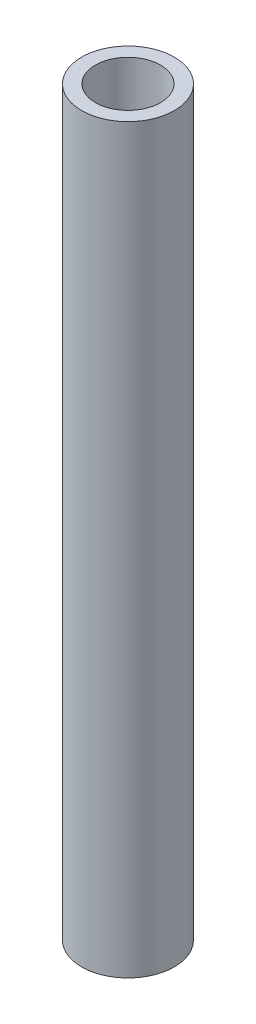
ISO-10303-21;
HEADER;
FILE_DESCRIPTION(('STEP AP214'),'2;1');
FILE_NAME('part.step','',(''),(''),'','','');
FILE_SCHEMA(('AUTOMOTIVE_DESIGN { 1 0 10303 214 1 1 1 1 }'));
ENDSEC;
DATA;
#1=APPLICATION_CONTEXT('core data for automotive mechanical design processes');
#2=APPLICATION_PROTOCOL_DEFINITION('international standard','automotive_design',2000,#1);
#3=PRODUCT_CONTEXT('',#1,'mechanical');
#4=PRODUCT('Part','Part','',(#3));
#5=PRODUCT_RELATED_PRODUCT_CATEGORY('part','',(#4));
#6=PRODUCT_DEFINITION_FORMATION('','',#4);
#7=PRODUCT_DEFINITION_CONTEXT('part definition',#1,'design');
#8=PRODUCT_DEFINITION('design','',#6,#7);
#9=PRODUCT_DEFINITION_SHAPE('','',#8);
#10=(LENGTH_UNIT() NAMED_UNIT(*) SI_UNIT(.MILLI.,.METRE.));
#11=(NAMED_UNIT(*) PLANE_ANGLE_UNIT() SI_UNIT($,.RADIAN.));
#12=(NAMED_UNIT(*) SI_UNIT($,.STERADIAN.) SOLID_ANGLE_UNIT());
#13=UNCERTAINTY_MEASURE_WITH_UNIT(LENGTH_MEASURE(1.E-05),#10,'distance_accuracy_value','');
#14=(GEOMETRIC_REPRESENTATION_CONTEXT(3) GLOBAL_UNCERTAINTY_ASSIGNED_CONTEXT((#13)) GLOBAL_UNIT_ASSIGNED_CONTEXT((#10,
#11,#12)) REPRESENTATION_CONTEXT('',''));
#15=CARTESIAN_POINT('',(0.,0.,0.));
#16=DIRECTION('',(0.,0.,1.));
#17=DIRECTION('',(1.,0.,0.));
#18=AXIS2_PLACEMENT_3D('',#15,#16,#17);
#19=CARTESIAN_POINT('',(0.,148.,0.));
#20=DIRECTION('',(0.,1.,0.));
#21=DIRECTION('',(0.,0.,1.));
#22=AXIS2_PLACEMENT_3D('',#19,#20,#21);
#23=PLANE('',#22);
#24=CARTESIAN_POINT('',(0.,148.,0.));
#25=DIRECTION('',(0.,1.,0.));
#26=DIRECTION('',(0.,0.,1.));
#27=AXIS2_PLACEMENT_3D('',#24,#25,#26);
#28=CIRCLE('',#27,9.25);
#29=CARTESIAN_POINT('',(0.,148.,9.25));
#30=VERTEX_POINT('',#29);
#31=EDGE_CURVE('E10',#30,#30,#28,.T.);
#32=ORIENTED_EDGE('',*,*,#31,.T.);
#33=EDGE_LOOP('',(#32));
#34=FACE_BOUND('',#33,.T.);
#35=CARTESIAN_POINT('',(0.,148.,0.));
#36=DIRECTION('',(0.,1.,0.));
#37=DIRECTION('',(0.,0.,1.));
#38=AXIS2_PLACEMENT_3D('',#35,#36,#37);
#39=CIRCLE('',#38,6.5);
#40=CARTESIAN_POINT('',(0.,148.,6.5));
#41=VERTEX_POINT('',#40);
#42=EDGE_CURVE('E42',#41,#41,#39,.T.);
#43=ORIENTED_EDGE('',*,*,#42,.F.);
#44=EDGE_LOOP('',(#43));
#45=FACE_BOUND('',#44,.T.);
#46=ADVANCED_FACE('F31',(#34,#45),#23,.T.);
#47=CARTESIAN_POINT('',(0.,0.,0.));
#48=DIRECTION('',(0.,1.,0.));
#49=DIRECTION('',(0.,0.,1.));
#50=AXIS2_PLACEMENT_3D('',#47,#48,#49);
#51=PLANE('',#50);
#52=CARTESIAN_POINT('',(0.,0.,0.));
#53=DIRECTION('',(0.,1.,0.));
#54=DIRECTION('',(0.,0.,1.));
#55=AXIS2_PLACEMENT_3D('',#52,#53,#54);
#56=CIRCLE('',#55,9.25);
#57=CARTESIAN_POINT('',(0.,0.,9.25));
#58=VERTEX_POINT('',#57);
#59=EDGE_CURVE('E35',#58,#58,#56,.T.);
#60=ORIENTED_EDGE('',*,*,#59,.F.);
#61=EDGE_LOOP('',(#60));
#62=FACE_BOUND('',#61,.T.);
#63=CARTESIAN_POINT('',(0.,0.,0.));
#64=DIRECTION('',(0.,1.,0.));
#65=DIRECTION('',(0.,0.,1.));
#66=AXIS2_PLACEMENT_3D('',#63,#64,#65);
#67=CIRCLE('',#66,6.5);
#68=CARTESIAN_POINT('',(0.,0.,6.5));
#69=VERTEX_POINT('',#68);
#70=EDGE_CURVE('E44',#69,#69,#67,.T.);
#71=ORIENTED_EDGE('',*,*,#70,.T.);
#72=EDGE_LOOP('',(#71));
#73=FACE_BOUND('',#72,.T.);
#74=ADVANCED_FACE('F54',(#62,#73),#51,.F.);
#75=CARTESIAN_POINT('',(0.,148.,0.));
#76=DIRECTION('',(0.,-1.,0.));
#77=DIRECTION('',(0.,0.,-1.));
#78=AXIS2_PLACEMENT_3D('',#75,#76,#77);
#79=CYLINDRICAL_SURFACE('',#78,9.25);
#80=ORIENTED_EDGE('',*,*,#31,.F.);
#81=EDGE_LOOP('',(#80));
#82=FACE_BOUND('',#81,.T.);
#83=ORIENTED_EDGE('',*,*,#59,.T.);
#84=EDGE_LOOP('',(#83));
#85=FACE_BOUND('',#84,.T.);
#86=ADVANCED_FACE('F33',(#82,#85),#79,.T.);
#87=CARTESIAN_POINT('',(0.,148.,0.));
#88=DIRECTION('',(0.,-1.,0.));
#89=DIRECTION('',(0.,0.,-1.));
#90=AXIS2_PLACEMENT_3D('',#87,#88,#89);
#91=CYLINDRICAL_SURFACE('',#90,6.5);
#92=ORIENTED_EDGE('',*,*,#42,.T.);
#93=EDGE_LOOP('',(#92));
#94=FACE_BOUND('',#93,.T.);
#95=ORIENTED_EDGE('',*,*,#70,.F.);
#96=EDGE_LOOP('',(#95));
#97=FACE_BOUND('',#96,.T.);
#98=ADVANCED_FACE('F50',(#94,#97),#91,.F.);
#99=CLOSED_SHELL('',(#46,#74,#86,#98));
#100=MANIFOLD_SOLID_BREP('B2',#99);
#101=ADVANCED_BREP_SHAPE_REPRESENTATION('',(#18,#100),#14);
#102=SHAPE_DEFINITION_REPRESENTATION(#9,#101);
ENDSEC;
END-ISO-10303-21;
